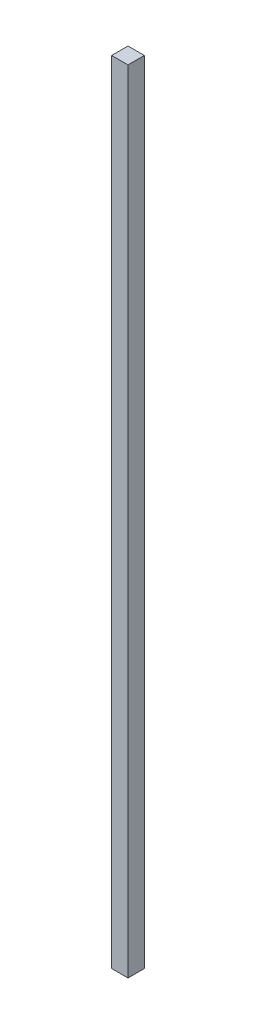
ISO-10303-21;
HEADER;
FILE_DESCRIPTION(('STEP AP214'),'2;1');
FILE_NAME('part.step','',(''),(''),'','','');
FILE_SCHEMA(('AUTOMOTIVE_DESIGN { 1 0 10303 214 1 1 1 1 }'));
ENDSEC;
DATA;
#1=APPLICATION_CONTEXT('core data for automotive mechanical design processes');
#2=APPLICATION_PROTOCOL_DEFINITION('international standard','automotive_design',2000,#1);
#3=PRODUCT_CONTEXT('',#1,'mechanical');
#4=PRODUCT('Part','Part','',(#3));
#5=PRODUCT_RELATED_PRODUCT_CATEGORY('part','',(#4));
#6=PRODUCT_DEFINITION_FORMATION('','',#4);
#7=PRODUCT_DEFINITION_CONTEXT('part definition',#1,'design');
#8=PRODUCT_DEFINITION('design','',#6,#7);
#9=PRODUCT_DEFINITION_SHAPE('','',#8);
#10=(LENGTH_UNIT() NAMED_UNIT(*) SI_UNIT(.MILLI.,.METRE.));
#11=(NAMED_UNIT(*) PLANE_ANGLE_UNIT() SI_UNIT($,.RADIAN.));
#12=(NAMED_UNIT(*) SI_UNIT($,.STERADIAN.) SOLID_ANGLE_UNIT());
#13=UNCERTAINTY_MEASURE_WITH_UNIT(LENGTH_MEASURE(1.E-05),#10,'distance_accuracy_value','');
#14=(GEOMETRIC_REPRESENTATION_CONTEXT(3) GLOBAL_UNCERTAINTY_ASSIGNED_CONTEXT((#13)) GLOBAL_UNIT_ASSIGNED_CONTEXT((#10,
#11,#12)) REPRESENTATION_CONTEXT('',''));
#15=CARTESIAN_POINT('',(0.,0.,0.));
#16=DIRECTION('',(0.,0.,1.));
#17=DIRECTION('',(1.,0.,0.));
#18=AXIS2_PLACEMENT_3D('',#15,#16,#17);
#19=CARTESIAN_POINT('',(-103.5,10000.,-103.5));
#20=DIRECTION('',(0.,0.,1.));
#21=DIRECTION('',(1.,0.,0.));
#22=AXIS2_PLACEMENT_3D('',#19,#20,#21);
#23=PLANE('',#22);
#24=DIRECTION('',(-1.,0.,0.));
#25=VECTOR('',#24,1.);
#26=CARTESIAN_POINT('',(-103.5,0.,-103.5));
#27=LINE('',#26,#25);
#28=CARTESIAN_POINT('',(103.5,0.,-103.5));
#29=VERTEX_POINT('',#28);
#30=CARTESIAN_POINT('',(-103.5,0.,-103.5));
#31=VERTEX_POINT('',#30);
#32=EDGE_CURVE('E131',#29,#31,#27,.T.);
#33=ORIENTED_EDGE('',*,*,#32,.T.);
#34=DIRECTION('',(0.,-1.,0.));
#35=VECTOR('',#34,1.);
#36=CARTESIAN_POINT('',(-103.5,10000.,-103.5));
#37=LINE('',#36,#35);
#38=CARTESIAN_POINT('',(-103.5,10000.,-103.5));
#39=VERTEX_POINT('',#38);
#40=EDGE_CURVE('E12',#39,#31,#37,.T.);
#41=ORIENTED_EDGE('',*,*,#40,.F.);
#42=DIRECTION('',(-1.,0.,0.));
#43=VECTOR('',#42,1.);
#44=CARTESIAN_POINT('',(-103.5,10000.,-103.5));
#45=LINE('',#44,#43);
#46=CARTESIAN_POINT('',(103.5,10000.,-103.5));
#47=VERTEX_POINT('',#46);
#48=EDGE_CURVE('E115',#47,#39,#45,.T.);
#49=ORIENTED_EDGE('',*,*,#48,.F.);
#50=DIRECTION('',(0.,-1.,0.));
#51=VECTOR('',#50,1.);
#52=CARTESIAN_POINT('',(103.5,10000.,-103.5));
#53=LINE('',#52,#51);
#54=EDGE_CURVE('E127',#47,#29,#53,.T.);
#55=ORIENTED_EDGE('',*,*,#54,.T.);
#56=EDGE_LOOP('',(#33,#41,#49,#55));
#57=FACE_BOUND('',#56,.T.);
#58=ADVANCED_FACE('F63',(#57),#23,.F.);
#59=CARTESIAN_POINT('',(-103.5,10000.,-103.5));
#60=DIRECTION('',(1.,0.,0.));
#61=DIRECTION('',(0.,0.,-1.));
#62=AXIS2_PLACEMENT_3D('',#59,#60,#61);
#63=PLANE('',#62);
#64=DIRECTION('',(0.,0.,1.));
#65=VECTOR('',#64,1.);
#66=CARTESIAN_POINT('',(-103.5,0.,-103.5));
#67=LINE('',#66,#65);
#68=CARTESIAN_POINT('',(-103.5,0.,103.5));
#69=VERTEX_POINT('',#68);
#70=EDGE_CURVE('E120',#31,#69,#67,.T.);
#71=ORIENTED_EDGE('',*,*,#70,.T.);
#72=DIRECTION('',(0.,-1.,0.));
#73=VECTOR('',#72,1.);
#74=CARTESIAN_POINT('',(-103.5,10000.,103.5));
#75=LINE('',#74,#73);
#76=CARTESIAN_POINT('',(-103.5,10000.,103.5));
#77=VERTEX_POINT('',#76);
#78=EDGE_CURVE('E72',#77,#69,#75,.T.);
#79=ORIENTED_EDGE('',*,*,#78,.F.);
#80=DIRECTION('',(0.,0.,1.));
#81=VECTOR('',#80,1.);
#82=CARTESIAN_POINT('',(-103.5,10000.,-103.5));
#83=LINE('',#82,#81);
#84=EDGE_CURVE('E110',#39,#77,#83,.T.);
#85=ORIENTED_EDGE('',*,*,#84,.F.);
#86=ORIENTED_EDGE('',*,*,#40,.T.);
#87=EDGE_LOOP('',(#71,#79,#85,#86));
#88=FACE_BOUND('',#87,.T.);
#89=ADVANCED_FACE('F119',(#88),#63,.F.);
#90=CARTESIAN_POINT('',(-103.5,10000.,103.5));
#91=DIRECTION('',(0.,0.,-1.));
#92=DIRECTION('',(-1.,0.,0.));
#93=AXIS2_PLACEMENT_3D('',#90,#91,#92);
#94=PLANE('',#93);
#95=DIRECTION('',(1.,0.,0.));
#96=VECTOR('',#95,1.);
#97=CARTESIAN_POINT('',(-103.5,0.,103.5));
#98=LINE('',#97,#96);
#99=CARTESIAN_POINT('',(103.5,0.,103.5));
#100=VERTEX_POINT('',#99);
#101=EDGE_CURVE('E97',#69,#100,#98,.T.);
#102=ORIENTED_EDGE('',*,*,#101,.T.);
#103=DIRECTION('',(0.,-1.,0.));
#104=VECTOR('',#103,1.);
#105=CARTESIAN_POINT('',(103.5,10000.,103.5));
#106=LINE('',#105,#104);
#107=CARTESIAN_POINT('',(103.5,10000.,103.5));
#108=VERTEX_POINT('',#107);
#109=EDGE_CURVE('E122',#108,#100,#106,.T.);
#110=ORIENTED_EDGE('',*,*,#109,.F.);
#111=DIRECTION('',(1.,0.,0.));
#112=VECTOR('',#111,1.);
#113=CARTESIAN_POINT('',(-103.5,10000.,103.5));
#114=LINE('',#113,#112);
#115=EDGE_CURVE('E113',#77,#108,#114,.T.);
#116=ORIENTED_EDGE('',*,*,#115,.F.);
#117=ORIENTED_EDGE('',*,*,#78,.T.);
#118=EDGE_LOOP('',(#102,#110,#116,#117));
#119=FACE_BOUND('',#118,.T.);
#120=ADVANCED_FACE('F123',(#119),#94,.F.);
#121=CARTESIAN_POINT('',(103.5,10000.,-103.5));
#122=DIRECTION('',(-1.,0.,0.));
#123=DIRECTION('',(0.,0.,1.));
#124=AXIS2_PLACEMENT_3D('',#121,#122,#123);
#125=PLANE('',#124);
#126=DIRECTION('',(0.,0.,-1.));
#127=VECTOR('',#126,1.);
#128=CARTESIAN_POINT('',(103.5,0.,-103.5));
#129=LINE('',#128,#127);
#130=EDGE_CURVE('E103',#100,#29,#129,.T.);
#131=ORIENTED_EDGE('',*,*,#130,.T.);
#132=ORIENTED_EDGE('',*,*,#54,.F.);
#133=DIRECTION('',(0.,0.,-1.));
#134=VECTOR('',#133,1.);
#135=CARTESIAN_POINT('',(103.5,10000.,-103.5));
#136=LINE('',#135,#134);
#137=EDGE_CURVE('E80',#108,#47,#136,.T.);
#138=ORIENTED_EDGE('',*,*,#137,.F.);
#139=ORIENTED_EDGE('',*,*,#109,.T.);
#140=EDGE_LOOP('',(#131,#132,#138,#139));
#141=FACE_BOUND('',#140,.T.);
#142=ADVANCED_FACE('F144',(#141),#125,.F.);
#143=CARTESIAN_POINT('',(0.,10000.,0.));
#144=DIRECTION('',(0.,-1.,0.));
#145=DIRECTION('',(0.,0.,-1.));
#146=AXIS2_PLACEMENT_3D('',#143,#144,#145);
#147=PLANE('',#146);
#148=ORIENTED_EDGE('',*,*,#48,.T.);
#149=ORIENTED_EDGE('',*,*,#84,.T.);
#150=ORIENTED_EDGE('',*,*,#115,.T.);
#151=ORIENTED_EDGE('',*,*,#137,.T.);
#152=EDGE_LOOP('',(#148,#149,#150,#151));
#153=FACE_BOUND('',#152,.T.);
#154=ADVANCED_FACE('F111',(#153),#147,.F.);
#155=CARTESIAN_POINT('',(0.,0.,0.));
#156=DIRECTION('',(0.,-1.,0.));
#157=DIRECTION('',(0.,0.,-1.));
#158=AXIS2_PLACEMENT_3D('',#155,#156,#157);
#159=PLANE('',#158);
#160=ORIENTED_EDGE('',*,*,#32,.F.);
#161=ORIENTED_EDGE('',*,*,#130,.F.);
#162=ORIENTED_EDGE('',*,*,#101,.F.);
#163=ORIENTED_EDGE('',*,*,#70,.F.);
#164=EDGE_LOOP('',(#160,#161,#162,#163));
#165=FACE_BOUND('',#164,.T.);
#166=ADVANCED_FACE('F147',(#165),#159,.T.);
#167=CLOSED_SHELL('',(#58,#89,#120,#142,#154,#166));
#168=MANIFOLD_SOLID_BREP('B2',#167);
#169=ADVANCED_BREP_SHAPE_REPRESENTATION('',(#18,#168),#14);
#170=SHAPE_DEFINITION_REPRESENTATION(#9,#169);
ENDSEC;
END-ISO-10303-21;
